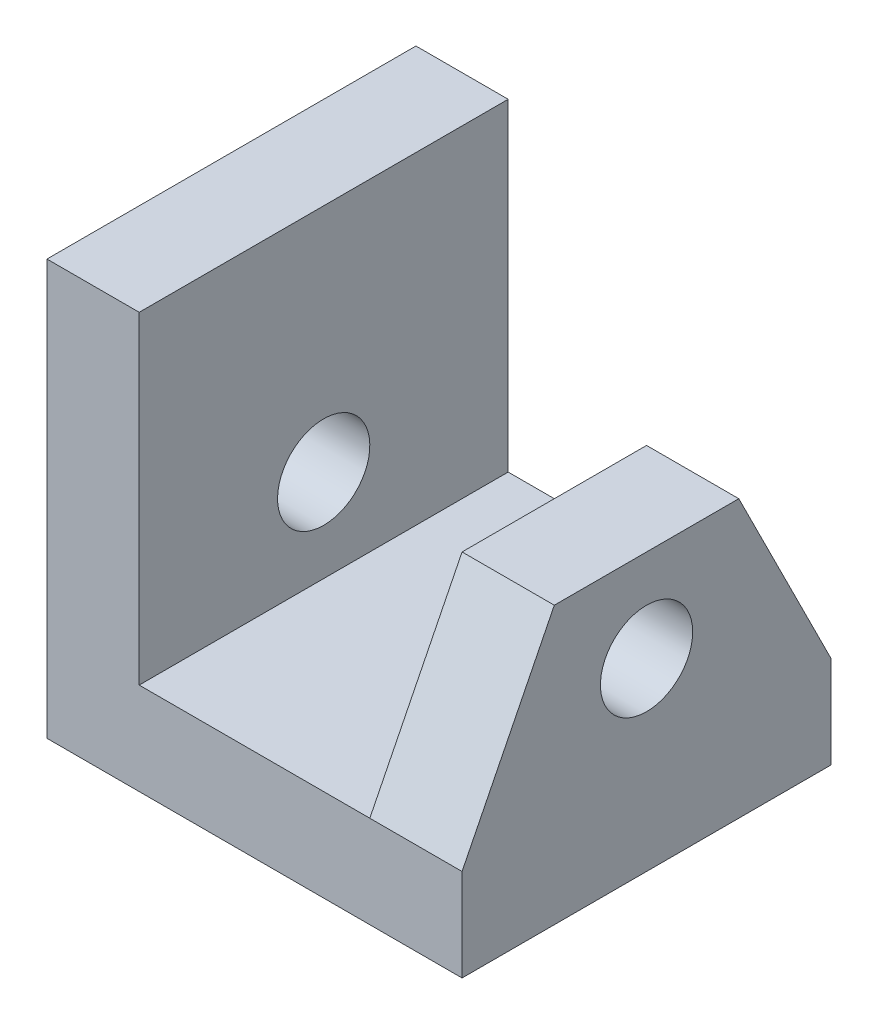
ISO-10303-21;
HEADER;
FILE_DESCRIPTION(('STEP AP214'),'2;1');
FILE_NAME('part.step','',(''),(''),'','','');
FILE_SCHEMA(('AUTOMOTIVE_DESIGN { 1 0 10303 214 1 1 1 1 }'));
ENDSEC;
DATA;
#1=APPLICATION_CONTEXT('core data for automotive mechanical design processes');
#2=APPLICATION_PROTOCOL_DEFINITION('international standard','automotive_design',2000,#1);
#3=PRODUCT_CONTEXT('',#1,'mechanical');
#4=PRODUCT('Part','Part','',(#3));
#5=PRODUCT_RELATED_PRODUCT_CATEGORY('part','',(#4));
#6=PRODUCT_DEFINITION_FORMATION('','',#4);
#7=PRODUCT_DEFINITION_CONTEXT('part definition',#1,'design');
#8=PRODUCT_DEFINITION('design','',#6,#7);
#9=PRODUCT_DEFINITION_SHAPE('','',#8);
#10=(LENGTH_UNIT() NAMED_UNIT(*) SI_UNIT(.MILLI.,.METRE.));
#11=(NAMED_UNIT(*) PLANE_ANGLE_UNIT() SI_UNIT($,.RADIAN.));
#12=(NAMED_UNIT(*) SI_UNIT($,.STERADIAN.) SOLID_ANGLE_UNIT());
#13=UNCERTAINTY_MEASURE_WITH_UNIT(LENGTH_MEASURE(1.E-05),#10,'distance_accuracy_value','');
#14=(GEOMETRIC_REPRESENTATION_CONTEXT(3) GLOBAL_UNCERTAINTY_ASSIGNED_CONTEXT((#13)) GLOBAL_UNIT_ASSIGNED_CONTEXT((#10,
#11,#12)) REPRESENTATION_CONTEXT('',''));
#15=CARTESIAN_POINT('',(0.,0.,0.));
#16=DIRECTION('',(0.,0.,1.));
#17=DIRECTION('',(1.,0.,0.));
#18=AXIS2_PLACEMENT_3D('',#15,#16,#17);
#19=CARTESIAN_POINT('',(45.,0.,20.));
#20=DIRECTION('',(-1.,0.,0.));
#21=DIRECTION('',(0.,0.,1.));
#22=AXIS2_PLACEMENT_3D('',#19,#20,#21);
#23=PLANE('',#22);
#24=CARTESIAN_POINT('',(45.,20.,0.));
#25=DIRECTION('',(1.,0.,0.));
#26=DIRECTION('',(0.,0.,-1.));
#27=AXIS2_PLACEMENT_3D('',#24,#25,#26);
#28=CIRCLE('',#27,5.);
#29=CARTESIAN_POINT('',(45.,20.,-5.));
#30=VERTEX_POINT('',#29);
#31=EDGE_CURVE('E274',#30,#30,#28,.T.);
#32=ORIENTED_EDGE('',*,*,#31,.F.);
#33=EDGE_LOOP('',(#32));
#34=FACE_BOUND('',#33,.T.);
#35=DIRECTION('',(0.,-0.894427190999916,-0.447213595499958));
#36=VECTOR('',#35,1.);
#37=CARTESIAN_POINT('',(45.,18.,-16.));
#38=LINE('',#37,#36);
#39=CARTESIAN_POINT('',(45.,30.,-10.));
#40=VERTEX_POINT('',#39);
#41=CARTESIAN_POINT('',(45.0000025,10.,-20.));
#42=VERTEX_POINT('',#41);
#43=EDGE_CURVE('E162',#40,#42,#38,.T.);
#44=ORIENTED_EDGE('',*,*,#43,.F.);
#45=DIRECTION('',(0.,0.,-1.));
#46=VECTOR('',#45,1.);
#47=CARTESIAN_POINT('',(45.,30.,20.));
#48=LINE('',#47,#46);
#49=CARTESIAN_POINT('',(45.,30.,10.));
#50=VERTEX_POINT('',#49);
#51=EDGE_CURVE('E195',#50,#40,#48,.T.);
#52=ORIENTED_EDGE('',*,*,#51,.F.);
#53=DIRECTION('',(0.,-0.894427190999916,0.447213595499958));
#54=VECTOR('',#53,1.);
#55=CARTESIAN_POINT('',(45.,2.,24.));
#56=LINE('',#55,#54);
#57=CARTESIAN_POINT('',(45.,10.,20.));
#58=VERTEX_POINT('',#57);
#59=EDGE_CURVE('E129',#50,#58,#56,.T.);
#60=ORIENTED_EDGE('',*,*,#59,.T.);
#61=DIRECTION('',(0.,1.,0.));
#62=VECTOR('',#61,1.);
#63=CARTESIAN_POINT('',(45.,0.,20.));
#64=LINE('',#63,#62);
#65=CARTESIAN_POINT('',(45.,0.,20.));
#66=VERTEX_POINT('',#65);
#67=EDGE_CURVE('E112',#66,#58,#64,.T.);
#68=ORIENTED_EDGE('',*,*,#67,.F.);
#69=DIRECTION('',(0.,0.,-1.));
#70=VECTOR('',#69,1.);
#71=CARTESIAN_POINT('',(45.,0.,20.));
#72=LINE('',#71,#70);
#73=CARTESIAN_POINT('',(45.,0.,-20.));
#74=VERTEX_POINT('',#73);
#75=EDGE_CURVE('E117',#66,#74,#72,.T.);
#76=ORIENTED_EDGE('',*,*,#75,.T.);
#77=DIRECTION('',(0.,1.,0.));
#78=VECTOR('',#77,1.);
#79=CARTESIAN_POINT('',(45.,0.,-20.));
#80=LINE('',#79,#78);
#81=EDGE_CURVE('E44',#74,#42,#80,.T.);
#82=ORIENTED_EDGE('',*,*,#81,.T.);
#83=EDGE_LOOP('',(#44,#52,#60,#68,#76,#82));
#84=FACE_BOUND('',#83,.T.);
#85=ADVANCED_FACE('F40',(#34,#84),#23,.F.);
#86=CARTESIAN_POINT('',(0.,0.,-20.));
#87=DIRECTION('',(0.,0.,1.));
#88=DIRECTION('',(1.,0.,0.));
#89=AXIS2_PLACEMENT_3D('',#86,#87,#88);
#90=PLANE('',#89);
#91=DIRECTION('',(1.,0.,0.));
#92=VECTOR('',#91,1.);
#93=CARTESIAN_POINT('',(35.,10.,-20.));
#94=LINE('',#93,#92);
#95=CARTESIAN_POINT('',(35.,10.,-20.));
#96=VERTEX_POINT('',#95);
#97=EDGE_CURVE('E159',#96,#42,#94,.T.);
#98=ORIENTED_EDGE('',*,*,#97,.T.);
#99=ORIENTED_EDGE('',*,*,#81,.F.);
#100=DIRECTION('',(1.,0.,0.));
#101=VECTOR('',#100,1.);
#102=CARTESIAN_POINT('',(0.,0.,-20.));
#103=LINE('',#102,#101);
#104=CARTESIAN_POINT('',(0.,0.,-20.));
#105=VERTEX_POINT('',#104);
#106=EDGE_CURVE('E120',#105,#74,#103,.T.);
#107=ORIENTED_EDGE('',*,*,#106,.F.);
#108=DIRECTION('',(0.,-1.,0.));
#109=VECTOR('',#108,1.);
#110=CARTESIAN_POINT('',(0.,0.,-20.));
#111=LINE('',#110,#109);
#112=CARTESIAN_POINT('',(0.,45.,-20.));
#113=VERTEX_POINT('',#112);
#114=EDGE_CURVE('E142',#113,#105,#111,.T.);
#115=ORIENTED_EDGE('',*,*,#114,.F.);
#116=DIRECTION('',(-1.,0.,0.));
#117=VECTOR('',#116,1.);
#118=CARTESIAN_POINT('',(0.,45.,-20.));
#119=LINE('',#118,#117);
#120=CARTESIAN_POINT('',(9.99999999999999,45.,-20.));
#121=VERTEX_POINT('',#120);
#122=EDGE_CURVE('E139',#121,#113,#119,.T.);
#123=ORIENTED_EDGE('',*,*,#122,.F.);
#124=DIRECTION('',(0.,1.,0.));
#125=VECTOR('',#124,1.);
#126=CARTESIAN_POINT('',(9.99999999999999,0.,-20.));
#127=LINE('',#126,#125);
#128=CARTESIAN_POINT('',(9.99999999999999,9.99999999999999,-20.));
#129=VERTEX_POINT('',#128);
#130=EDGE_CURVE('E91',#129,#121,#127,.T.);
#131=ORIENTED_EDGE('',*,*,#130,.F.);
#132=DIRECTION('',(-1.,0.,0.));
#133=VECTOR('',#132,1.);
#134=CARTESIAN_POINT('',(0.,9.99999999999999,-20.));
#135=LINE('',#134,#133);
#136=EDGE_CURVE('E147',#96,#129,#135,.T.);
#137=ORIENTED_EDGE('',*,*,#136,.F.);
#138=EDGE_LOOP('',(#98,#99,#107,#115,#123,#131,#137));
#139=FACE_BOUND('',#138,.T.);
#140=ADVANCED_FACE('F154',(#139),#90,.F.);
#141=CARTESIAN_POINT('',(0.,30.,20.));
#142=DIRECTION('',(0.,-1.,0.));
#143=DIRECTION('',(0.,0.,-1.));
#144=AXIS2_PLACEMENT_3D('',#141,#142,#143);
#145=PLANE('',#144);
#146=DIRECTION('',(-1.,0.,0.));
#147=VECTOR('',#146,1.);
#148=CARTESIAN_POINT('',(45.000055,30.,-10.));
#149=LINE('',#148,#147);
#150=CARTESIAN_POINT('',(35.,30.,-10.));
#151=VERTEX_POINT('',#150);
#152=EDGE_CURVE('E180',#40,#151,#149,.T.);
#153=ORIENTED_EDGE('',*,*,#152,.T.);
#154=DIRECTION('',(0.,0.,-1.));
#155=VECTOR('',#154,1.);
#156=CARTESIAN_POINT('',(35.,30.,20.));
#157=LINE('',#156,#155);
#158=CARTESIAN_POINT('',(35.,30.,10.));
#159=VERTEX_POINT('',#158);
#160=EDGE_CURVE('E143',#159,#151,#157,.T.);
#161=ORIENTED_EDGE('',*,*,#160,.F.);
#162=DIRECTION('',(-1.,0.,0.));
#163=VECTOR('',#162,1.);
#164=CARTESIAN_POINT('',(45.000012,30.,10.));
#165=LINE('',#164,#163);
#166=EDGE_CURVE('E58',#50,#159,#165,.T.);
#167=ORIENTED_EDGE('',*,*,#166,.F.);
#168=ORIENTED_EDGE('',*,*,#51,.T.);
#169=EDGE_LOOP('',(#153,#161,#167,#168));
#170=FACE_BOUND('',#169,.T.);
#171=ADVANCED_FACE('F221',(#170),#145,.F.);
#172=CARTESIAN_POINT('',(35.,0.,20.));
#173=DIRECTION('',(1.,0.,0.));
#174=DIRECTION('',(0.,0.,-1.));
#175=AXIS2_PLACEMENT_3D('',#172,#173,#174);
#176=PLANE('',#175);
#177=CARTESIAN_POINT('',(35.,20.,0.));
#178=DIRECTION('',(1.,0.,0.));
#179=DIRECTION('',(0.,0.,-1.));
#180=AXIS2_PLACEMENT_3D('',#177,#178,#179);
#181=CIRCLE('',#180,5.);
#182=CARTESIAN_POINT('',(35.,20.,-5.));
#183=VERTEX_POINT('',#182);
#184=EDGE_CURVE('E198',#183,#183,#181,.T.);
#185=ORIENTED_EDGE('',*,*,#184,.T.);
#186=EDGE_LOOP('',(#185));
#187=FACE_BOUND('',#186,.T.);
#188=DIRECTION('',(0.,-0.894427190999916,-0.447213595499958));
#189=VECTOR('',#188,1.);
#190=CARTESIAN_POINT('',(35.,10.,-20.));
#191=LINE('',#190,#189);
#192=EDGE_CURVE('E178',#151,#96,#191,.T.);
#193=ORIENTED_EDGE('',*,*,#192,.T.);
#194=DIRECTION('',(0.,0.,-1.));
#195=VECTOR('',#194,1.);
#196=CARTESIAN_POINT('',(35.,10.,20.));
#197=LINE('',#196,#195);
#198=CARTESIAN_POINT('',(35.,10.,20.));
#199=VERTEX_POINT('',#198);
#200=EDGE_CURVE('E187',#199,#96,#197,.T.);
#201=ORIENTED_EDGE('',*,*,#200,.F.);
#202=DIRECTION('',(0.,-0.894427190999916,0.447213595499958));
#203=VECTOR('',#202,1.);
#204=CARTESIAN_POINT('',(35.,10.,20.));
#205=LINE('',#204,#203);
#206=EDGE_CURVE('E264',#159,#199,#205,.T.);
#207=ORIENTED_EDGE('',*,*,#206,.F.);
#208=ORIENTED_EDGE('',*,*,#160,.T.);
#209=EDGE_LOOP('',(#193,#201,#207,#208));
#210=FACE_BOUND('',#209,.T.);
#211=ADVANCED_FACE('F185',(#187,#210),#176,.F.);
#212=CARTESIAN_POINT('',(0.,9.99999999999999,20.));
#213=DIRECTION('',(0.,-1.,0.));
#214=DIRECTION('',(1.,0.,0.));
#215=AXIS2_PLACEMENT_3D('',#212,#213,#214);
#216=PLANE('',#215);
#217=ORIENTED_EDGE('',*,*,#200,.T.);
#218=ORIENTED_EDGE('',*,*,#136,.T.);
#219=DIRECTION('',(0.,0.,-1.));
#220=VECTOR('',#219,1.);
#221=CARTESIAN_POINT('',(9.99999999999999,9.99999999999999,20.));
#222=LINE('',#221,#220);
#223=CARTESIAN_POINT('',(9.99999999999999,9.99999999999999,20.));
#224=VERTEX_POINT('',#223);
#225=EDGE_CURVE('E124',#224,#129,#222,.T.);
#226=ORIENTED_EDGE('',*,*,#225,.F.);
#227=DIRECTION('',(-1.,0.,0.));
#228=VECTOR('',#227,1.);
#229=CARTESIAN_POINT('',(0.,9.99999999999999,20.));
#230=LINE('',#229,#228);
#231=EDGE_CURVE('E130',#199,#224,#230,.T.);
#232=ORIENTED_EDGE('',*,*,#231,.F.);
#233=EDGE_LOOP('',(#217,#218,#226,#232));
#234=FACE_BOUND('',#233,.T.);
#235=ADVANCED_FACE('F194',(#234),#216,.F.);
#236=CARTESIAN_POINT('',(0.,45.,20.));
#237=DIRECTION('',(0.,-1.,0.));
#238=DIRECTION('',(0.,0.,-1.));
#239=AXIS2_PLACEMENT_3D('',#236,#237,#238);
#240=PLANE('',#239);
#241=ORIENTED_EDGE('',*,*,#122,.T.);
#242=DIRECTION('',(0.,0.,-1.));
#243=VECTOR('',#242,1.);
#244=CARTESIAN_POINT('',(0.,45.,20.));
#245=LINE('',#244,#243);
#246=CARTESIAN_POINT('',(0.,45.,20.));
#247=VERTEX_POINT('',#246);
#248=EDGE_CURVE('E12',#247,#113,#245,.T.);
#249=ORIENTED_EDGE('',*,*,#248,.F.);
#250=DIRECTION('',(-1.,0.,0.));
#251=VECTOR('',#250,1.);
#252=CARTESIAN_POINT('',(0.,45.,20.));
#253=LINE('',#252,#251);
#254=CARTESIAN_POINT('',(9.99999999999999,45.,20.));
#255=VERTEX_POINT('',#254);
#256=EDGE_CURVE('E150',#255,#247,#253,.T.);
#257=ORIENTED_EDGE('',*,*,#256,.F.);
#258=DIRECTION('',(0.,0.,-1.));
#259=VECTOR('',#258,1.);
#260=CARTESIAN_POINT('',(9.99999999999999,45.,20.));
#261=LINE('',#260,#259);
#262=EDGE_CURVE('E138',#255,#121,#261,.T.);
#263=ORIENTED_EDGE('',*,*,#262,.T.);
#264=EDGE_LOOP('',(#241,#249,#257,#263));
#265=FACE_BOUND('',#264,.T.);
#266=ADVANCED_FACE('F42',(#265),#240,.F.);
#267=CARTESIAN_POINT('',(0.,0.,20.));
#268=DIRECTION('',(1.,0.,0.));
#269=DIRECTION('',(0.,1.,0.));
#270=AXIS2_PLACEMENT_3D('',#267,#268,#269);
#271=PLANE('',#270);
#272=CARTESIAN_POINT('',(0.,20.,0.));
#273=DIRECTION('',(-1.,0.,0.));
#274=DIRECTION('',(0.,-1.,0.));
#275=AXIS2_PLACEMENT_3D('',#272,#273,#274);
#276=CIRCLE('',#275,5.);
#277=CARTESIAN_POINT('',(0.,15.,0.));
#278=VERTEX_POINT('',#277);
#279=EDGE_CURVE('E256',#278,#278,#276,.T.);
#280=ORIENTED_EDGE('',*,*,#279,.F.);
#281=EDGE_LOOP('',(#280));
#282=FACE_BOUND('',#281,.T.);
#283=ORIENTED_EDGE('',*,*,#114,.T.);
#284=DIRECTION('',(0.,0.,-1.));
#285=VECTOR('',#284,1.);
#286=CARTESIAN_POINT('',(0.,0.,20.));
#287=LINE('',#286,#285);
#288=CARTESIAN_POINT('',(0.,0.,20.));
#289=VERTEX_POINT('',#288);
#290=EDGE_CURVE('E50',#289,#105,#287,.T.);
#291=ORIENTED_EDGE('',*,*,#290,.F.);
#292=DIRECTION('',(0.,-1.,0.));
#293=VECTOR('',#292,1.);
#294=CARTESIAN_POINT('',(0.,0.,20.));
#295=LINE('',#294,#293);
#296=EDGE_CURVE('E99',#247,#289,#295,.T.);
#297=ORIENTED_EDGE('',*,*,#296,.F.);
#298=ORIENTED_EDGE('',*,*,#248,.T.);
#299=EDGE_LOOP('',(#283,#291,#297,#298));
#300=FACE_BOUND('',#299,.T.);
#301=ADVANCED_FACE('F205',(#282,#300),#271,.F.);
#302=CARTESIAN_POINT('',(0.,0.,20.));
#303=DIRECTION('',(0.,1.,0.));
#304=DIRECTION('',(0.,0.,1.));
#305=AXIS2_PLACEMENT_3D('',#302,#303,#304);
#306=PLANE('',#305);
#307=ORIENTED_EDGE('',*,*,#106,.T.);
#308=ORIENTED_EDGE('',*,*,#75,.F.);
#309=DIRECTION('',(1.,0.,0.));
#310=VECTOR('',#309,1.);
#311=CARTESIAN_POINT('',(0.,0.,20.));
#312=LINE('',#311,#310);
#313=EDGE_CURVE('E106',#289,#66,#312,.T.);
#314=ORIENTED_EDGE('',*,*,#313,.F.);
#315=ORIENTED_EDGE('',*,*,#290,.T.);
#316=EDGE_LOOP('',(#307,#308,#314,#315));
#317=FACE_BOUND('',#316,.T.);
#318=ADVANCED_FACE('F118',(#317),#306,.F.);
#319=CARTESIAN_POINT('',(9.99999999999999,0.,20.));
#320=DIRECTION('',(-1.,0.,0.));
#321=DIRECTION('',(0.,0.,1.));
#322=AXIS2_PLACEMENT_3D('',#319,#320,#321);
#323=PLANE('',#322);
#324=CARTESIAN_POINT('',(10.,20.,0.));
#325=DIRECTION('',(-1.,0.,0.));
#326=DIRECTION('',(0.,-1.,0.));
#327=AXIS2_PLACEMENT_3D('',#324,#325,#326);
#328=CIRCLE('',#327,5.);
#329=CARTESIAN_POINT('',(10.,15.,0.));
#330=VERTEX_POINT('',#329);
#331=EDGE_CURVE('E189',#330,#330,#328,.T.);
#332=ORIENTED_EDGE('',*,*,#331,.T.);
#333=EDGE_LOOP('',(#332));
#334=FACE_BOUND('',#333,.T.);
#335=ORIENTED_EDGE('',*,*,#130,.T.);
#336=ORIENTED_EDGE('',*,*,#262,.F.);
#337=DIRECTION('',(0.,1.,0.));
#338=VECTOR('',#337,1.);
#339=CARTESIAN_POINT('',(9.99999999999999,0.,20.));
#340=LINE('',#339,#338);
#341=EDGE_CURVE('E67',#224,#255,#340,.T.);
#342=ORIENTED_EDGE('',*,*,#341,.F.);
#343=ORIENTED_EDGE('',*,*,#225,.T.);
#344=EDGE_LOOP('',(#335,#336,#342,#343));
#345=FACE_BOUND('',#344,.T.);
#346=ADVANCED_FACE('F212',(#334,#345),#323,.F.);
#347=CARTESIAN_POINT('',(0.,0.,20.));
#348=DIRECTION('',(0.,0.,1.));
#349=DIRECTION('',(1.,0.,0.));
#350=AXIS2_PLACEMENT_3D('',#347,#348,#349);
#351=PLANE('',#350);
#352=DIRECTION('',(1.,0.,0.));
#353=VECTOR('',#352,1.);
#354=CARTESIAN_POINT('',(35.,10.,20.));
#355=LINE('',#354,#353);
#356=EDGE_CURVE('E268',#199,#58,#355,.T.);
#357=ORIENTED_EDGE('',*,*,#356,.F.);
#358=ORIENTED_EDGE('',*,*,#231,.T.);
#359=ORIENTED_EDGE('',*,*,#341,.T.);
#360=ORIENTED_EDGE('',*,*,#256,.T.);
#361=ORIENTED_EDGE('',*,*,#296,.T.);
#362=ORIENTED_EDGE('',*,*,#313,.T.);
#363=ORIENTED_EDGE('',*,*,#67,.T.);
#364=EDGE_LOOP('',(#357,#358,#359,#360,#361,#362,#363));
#365=FACE_BOUND('',#364,.T.);
#366=ADVANCED_FACE('F109',(#365),#351,.T.);
#367=CARTESIAN_POINT('',(35.,20.,0.));
#368=DIRECTION('',(1.,0.,0.));
#369=DIRECTION('',(0.,0.,-1.));
#370=AXIS2_PLACEMENT_3D('',#367,#368,#369);
#371=CYLINDRICAL_SURFACE('',#370,5.);
#372=ORIENTED_EDGE('',*,*,#184,.F.);
#373=EDGE_LOOP('',(#372));
#374=FACE_BOUND('',#373,.T.);
#375=ORIENTED_EDGE('',*,*,#31,.T.);
#376=EDGE_LOOP('',(#375));
#377=FACE_BOUND('',#376,.T.);
#378=ADVANCED_FACE('F232',(#374,#377),#371,.F.);
#379=CARTESIAN_POINT('',(45.000012,10.,20.));
#380=DIRECTION('',(0.,-0.447213595499958,-0.894427190999916));
#381=DIRECTION('',(0.,0.894427190999916,-0.447213595499958));
#382=AXIS2_PLACEMENT_3D('',#379,#380,#381);
#383=PLANE('',#382);
#384=ORIENTED_EDGE('',*,*,#166,.T.);
#385=ORIENTED_EDGE('',*,*,#206,.T.);
#386=ORIENTED_EDGE('',*,*,#356,.T.);
#387=ORIENTED_EDGE('',*,*,#59,.F.);
#388=EDGE_LOOP('',(#384,#385,#386,#387));
#389=FACE_BOUND('',#388,.T.);
#390=ADVANCED_FACE('F241',(#389),#383,.F.);
#391=CARTESIAN_POINT('',(45.000055,10.,-20.));
#392=DIRECTION('',(0.,0.447213595499958,-0.894427190999916));
#393=DIRECTION('',(0.,0.894427190999916,0.447213595499958));
#394=AXIS2_PLACEMENT_3D('',#391,#392,#393);
#395=PLANE('',#394);
#396=ORIENTED_EDGE('',*,*,#43,.T.);
#397=ORIENTED_EDGE('',*,*,#97,.F.);
#398=ORIENTED_EDGE('',*,*,#192,.F.);
#399=ORIENTED_EDGE('',*,*,#152,.F.);
#400=EDGE_LOOP('',(#396,#397,#398,#399));
#401=FACE_BOUND('',#400,.T.);
#402=ADVANCED_FACE('F177',(#401),#395,.T.);
#403=CARTESIAN_POINT('',(10.,20.,0.));
#404=DIRECTION('',(-1.,0.,0.));
#405=DIRECTION('',(0.,-1.,0.));
#406=AXIS2_PLACEMENT_3D('',#403,#404,#405);
#407=CYLINDRICAL_SURFACE('',#406,5.);
#408=ORIENTED_EDGE('',*,*,#331,.F.);
#409=EDGE_LOOP('',(#408));
#410=FACE_BOUND('',#409,.T.);
#411=ORIENTED_EDGE('',*,*,#279,.T.);
#412=EDGE_LOOP('',(#411));
#413=FACE_BOUND('',#412,.T.);
#414=ADVANCED_FACE('F247',(#410,#413),#407,.F.);
#415=CLOSED_SHELL('',(#85,#140,#171,#211,#235,#266,#301,#318,#346,#366,#378,#390,#402,#414));
#416=MANIFOLD_SOLID_BREP('B2',#415);
#417=ADVANCED_BREP_SHAPE_REPRESENTATION('',(#18,#416),#14);
#418=SHAPE_DEFINITION_REPRESENTATION(#9,#417);
ENDSEC;
END-ISO-10303-21;
